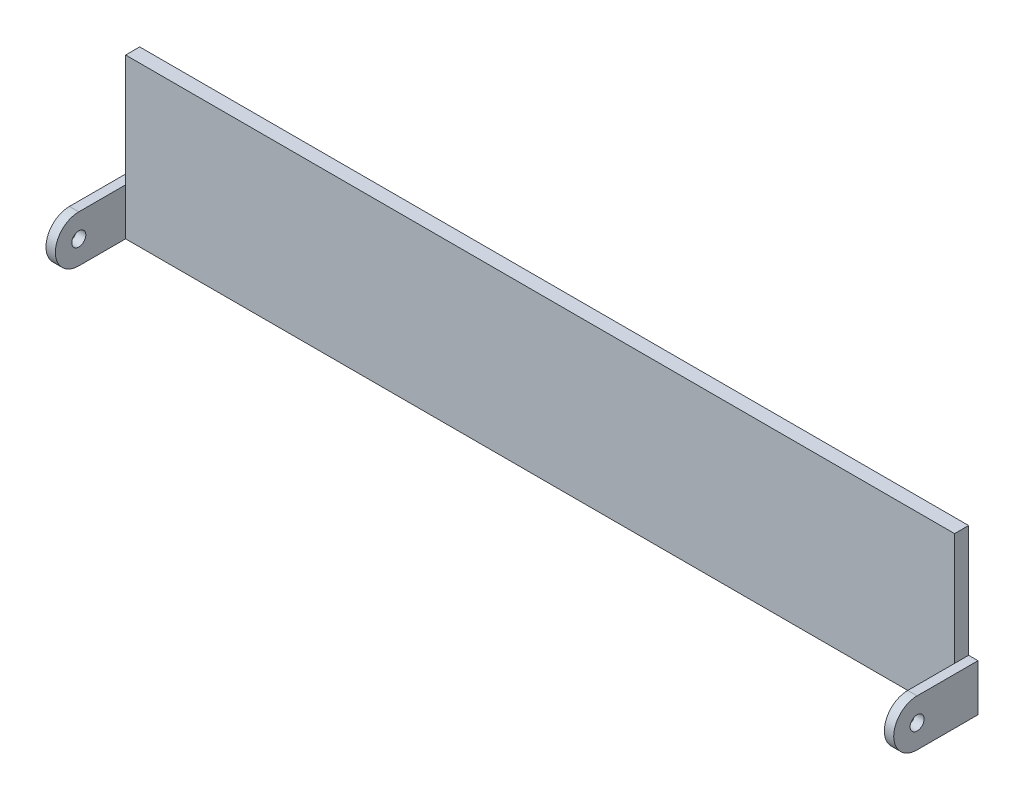
ISO-10303-21;
HEADER;
FILE_DESCRIPTION(('STEP AP214'),'2;1');
FILE_NAME('part.step','',(''),(''),'','','');
FILE_SCHEMA(('AUTOMOTIVE_DESIGN { 1 0 10303 214 1 1 1 1 }'));
ENDSEC;
DATA;
#1=APPLICATION_CONTEXT('core data for automotive mechanical design processes');
#2=APPLICATION_PROTOCOL_DEFINITION('international standard','automotive_design',2000,#1);
#3=PRODUCT_CONTEXT('',#1,'mechanical');
#4=PRODUCT('Part','Part','',(#3));
#5=PRODUCT_RELATED_PRODUCT_CATEGORY('part','',(#4));
#6=PRODUCT_DEFINITION_FORMATION('','',#4);
#7=PRODUCT_DEFINITION_CONTEXT('part definition',#1,'design');
#8=PRODUCT_DEFINITION('design','',#6,#7);
#9=PRODUCT_DEFINITION_SHAPE('','',#8);
#10=(LENGTH_UNIT() NAMED_UNIT(*) SI_UNIT(.MILLI.,.METRE.));
#11=(NAMED_UNIT(*) PLANE_ANGLE_UNIT() SI_UNIT($,.RADIAN.));
#12=(NAMED_UNIT(*) SI_UNIT($,.STERADIAN.) SOLID_ANGLE_UNIT());
#13=UNCERTAINTY_MEASURE_WITH_UNIT(LENGTH_MEASURE(1.E-05),#10,'distance_accuracy_value','');
#14=(GEOMETRIC_REPRESENTATION_CONTEXT(3) GLOBAL_UNCERTAINTY_ASSIGNED_CONTEXT((#13)) GLOBAL_UNIT_ASSIGNED_CONTEXT((#10,
#11,#12)) REPRESENTATION_CONTEXT('',''));
#15=CARTESIAN_POINT('',(0.,0.,0.));
#16=DIRECTION('',(0.,0.,1.));
#17=DIRECTION('',(1.,0.,0.));
#18=AXIS2_PLACEMENT_3D('',#15,#16,#17);
#19=CARTESIAN_POINT('',(90.5,-21.5,3.));
#20=DIRECTION('',(-1.,0.,0.));
#21=DIRECTION('',(0.,0.,1.));
#22=AXIS2_PLACEMENT_3D('',#19,#20,#21);
#23=PLANE('',#22);
#24=DIRECTION('',(0.,0.,1.));
#25=VECTOR('',#24,1.);
#26=CARTESIAN_POINT('',(90.5,-11.5,0.));
#27=LINE('',#26,#25);
#28=CARTESIAN_POINT('',(90.5,-11.5,0.));
#29=VERTEX_POINT('',#28);
#30=CARTESIAN_POINT('',(90.5,-11.5,3.));
#31=VERTEX_POINT('',#30);
#32=EDGE_CURVE('E90',#29,#31,#27,.T.);
#33=ORIENTED_EDGE('',*,*,#32,.F.);
#34=DIRECTION('',(0.,1.,0.));
#35=VECTOR('',#34,1.);
#36=CARTESIAN_POINT('',(90.5,-21.5,0.));
#37=LINE('',#36,#35);
#38=CARTESIAN_POINT('',(90.5,12.5,0.));
#39=VERTEX_POINT('',#38);
#40=EDGE_CURVE('E235',#29,#39,#37,.T.);
#41=ORIENTED_EDGE('',*,*,#40,.T.);
#42=DIRECTION('',(0.,0.,-1.));
#43=VECTOR('',#42,1.);
#44=CARTESIAN_POINT('',(90.5,12.5,3.));
#45=LINE('',#44,#43);
#46=CARTESIAN_POINT('',(90.5,12.5,3.));
#47=VERTEX_POINT('',#46);
#48=EDGE_CURVE('E12',#47,#39,#45,.T.);
#49=ORIENTED_EDGE('',*,*,#48,.F.);
#50=DIRECTION('',(0.,1.,0.));
#51=VECTOR('',#50,1.);
#52=CARTESIAN_POINT('',(90.5,-21.5,3.));
#53=LINE('',#52,#51);
#54=EDGE_CURVE('E253',#31,#47,#53,.T.);
#55=ORIENTED_EDGE('',*,*,#54,.F.);
#56=EDGE_LOOP('',(#33,#41,#49,#55));
#57=FACE_BOUND('',#56,.T.);
#58=ADVANCED_FACE('F75',(#57),#23,.F.);
#59=CARTESIAN_POINT('',(-86.5,12.5,3.));
#60=DIRECTION('',(0.,-1.,0.));
#61=DIRECTION('',(0.,0.,-1.));
#62=AXIS2_PLACEMENT_3D('',#59,#60,#61);
#63=PLANE('',#62);
#64=DIRECTION('',(-1.,0.,0.));
#65=VECTOR('',#64,1.);
#66=CARTESIAN_POINT('',(-86.5,12.5,0.));
#67=LINE('',#66,#65);
#68=CARTESIAN_POINT('',(-86.5,12.5,0.));
#69=VERTEX_POINT('',#68);
#70=EDGE_CURVE('E266',#39,#69,#67,.T.);
#71=ORIENTED_EDGE('',*,*,#70,.T.);
#72=DIRECTION('',(0.,0.,-1.));
#73=VECTOR('',#72,1.);
#74=CARTESIAN_POINT('',(-86.5,12.5,3.));
#75=LINE('',#74,#73);
#76=CARTESIAN_POINT('',(-86.5,12.5,3.));
#77=VERTEX_POINT('',#76);
#78=EDGE_CURVE('E83',#77,#69,#75,.T.);
#79=ORIENTED_EDGE('',*,*,#78,.F.);
#80=DIRECTION('',(-1.,0.,0.));
#81=VECTOR('',#80,1.);
#82=CARTESIAN_POINT('',(-86.5,12.5,3.));
#83=LINE('',#82,#81);
#84=EDGE_CURVE('E252',#47,#77,#83,.T.);
#85=ORIENTED_EDGE('',*,*,#84,.F.);
#86=ORIENTED_EDGE('',*,*,#48,.T.);
#87=EDGE_LOOP('',(#71,#79,#85,#86));
#88=FACE_BOUND('',#87,.T.);
#89=ADVANCED_FACE('F295',(#88),#63,.F.);
#90=CARTESIAN_POINT('',(-86.5,-21.5,3.));
#91=DIRECTION('',(1.,0.,0.));
#92=DIRECTION('',(0.,0.,-1.));
#93=AXIS2_PLACEMENT_3D('',#90,#91,#92);
#94=PLANE('',#93);
#95=DIRECTION('',(0.,-1.,0.));
#96=VECTOR('',#95,1.);
#97=CARTESIAN_POINT('',(-86.5,-21.5,0.));
#98=LINE('',#97,#96);
#99=CARTESIAN_POINT('',(-86.5,-11.5,0.));
#100=VERTEX_POINT('',#99);
#101=EDGE_CURVE('E269',#69,#100,#98,.T.);
#102=ORIENTED_EDGE('',*,*,#101,.T.);
#103=DIRECTION('',(0.,0.,1.));
#104=VECTOR('',#103,1.);
#105=CARTESIAN_POINT('',(-86.5,-11.5,0.));
#106=LINE('',#105,#104);
#107=CARTESIAN_POINT('',(-86.5,-11.5,3.));
#108=VERTEX_POINT('',#107);
#109=EDGE_CURVE('E226',#100,#108,#106,.T.);
#110=ORIENTED_EDGE('',*,*,#109,.T.);
#111=DIRECTION('',(0.,-1.,0.));
#112=VECTOR('',#111,1.);
#113=CARTESIAN_POINT('',(-86.5,-21.5,3.));
#114=LINE('',#113,#112);
#115=EDGE_CURVE('E257',#77,#108,#114,.T.);
#116=ORIENTED_EDGE('',*,*,#115,.F.);
#117=ORIENTED_EDGE('',*,*,#78,.T.);
#118=EDGE_LOOP('',(#102,#110,#116,#117));
#119=FACE_BOUND('',#118,.T.);
#120=ADVANCED_FACE('F281',(#119),#94,.F.);
#121=CARTESIAN_POINT('',(-86.5,-21.5,3.));
#122=DIRECTION('',(0.,1.,0.));
#123=DIRECTION('',(0.,0.,1.));
#124=AXIS2_PLACEMENT_3D('',#121,#122,#123);
#125=PLANE('',#124);
#126=DIRECTION('',(1.,0.,0.));
#127=VECTOR('',#126,1.);
#128=CARTESIAN_POINT('',(-86.5,-21.5,0.));
#129=LINE('',#128,#127);
#130=CARTESIAN_POINT('',(-88.5,-21.5,0.));
#131=VERTEX_POINT('',#130);
#132=CARTESIAN_POINT('',(92.5,-21.5,0.));
#133=VERTEX_POINT('',#132);
#134=EDGE_CURVE('E273',#131,#133,#129,.T.);
#135=ORIENTED_EDGE('',*,*,#134,.T.);
#136=DIRECTION('',(0.,0.,1.));
#137=VECTOR('',#136,1.);
#138=CARTESIAN_POINT('',(92.5,-21.5,0.));
#139=LINE('',#138,#137);
#140=CARTESIAN_POINT('',(92.5,-21.5,13.));
#141=VERTEX_POINT('',#140);
#142=EDGE_CURVE('E190',#133,#141,#139,.T.);
#143=ORIENTED_EDGE('',*,*,#142,.T.);
#144=DIRECTION('',(-1.,0.,0.));
#145=VECTOR('',#144,1.);
#146=CARTESIAN_POINT('',(92.5,-21.5,13.));
#147=LINE('',#146,#145);
#148=CARTESIAN_POINT('',(90.5,-21.5,13.));
#149=VERTEX_POINT('',#148);
#150=EDGE_CURVE('E173',#141,#149,#147,.T.);
#151=ORIENTED_EDGE('',*,*,#150,.T.);
#152=DIRECTION('',(0.,0.,1.));
#153=VECTOR('',#152,1.);
#154=CARTESIAN_POINT('',(90.5,-21.5,0.));
#155=LINE('',#154,#153);
#156=CARTESIAN_POINT('',(90.5,-21.5,3.));
#157=VERTEX_POINT('',#156);
#158=EDGE_CURVE('E191',#157,#149,#155,.T.);
#159=ORIENTED_EDGE('',*,*,#158,.F.);
#160=DIRECTION('',(1.,0.,0.));
#161=VECTOR('',#160,1.);
#162=CARTESIAN_POINT('',(-86.5,-21.5,3.));
#163=LINE('',#162,#161);
#164=CARTESIAN_POINT('',(-86.5,-21.5,3.));
#165=VERTEX_POINT('',#164);
#166=EDGE_CURVE('E261',#165,#157,#163,.T.);
#167=ORIENTED_EDGE('',*,*,#166,.F.);
#168=DIRECTION('',(0.,0.,1.));
#169=VECTOR('',#168,1.);
#170=CARTESIAN_POINT('',(-86.5,-21.5,0.));
#171=LINE('',#170,#169);
#172=CARTESIAN_POINT('',(-86.5,-21.5,13.));
#173=VERTEX_POINT('',#172);
#174=EDGE_CURVE('E217',#165,#173,#171,.T.);
#175=ORIENTED_EDGE('',*,*,#174,.T.);
#176=DIRECTION('',(1.,0.,0.));
#177=VECTOR('',#176,1.);
#178=CARTESIAN_POINT('',(-88.5,-21.5,13.));
#179=LINE('',#178,#177);
#180=CARTESIAN_POINT('',(-88.5,-21.5,13.));
#181=VERTEX_POINT('',#180);
#182=EDGE_CURVE('E236',#181,#173,#179,.T.);
#183=ORIENTED_EDGE('',*,*,#182,.F.);
#184=DIRECTION('',(0.,0.,1.));
#185=VECTOR('',#184,1.);
#186=CARTESIAN_POINT('',(-88.5,-21.5,0.));
#187=LINE('',#186,#185);
#188=EDGE_CURVE('E216',#131,#181,#187,.T.);
#189=ORIENTED_EDGE('',*,*,#188,.F.);
#190=EDGE_LOOP('',(#135,#143,#151,#159,#167,#175,#183,#189));
#191=FACE_BOUND('',#190,.T.);
#192=ADVANCED_FACE('F298',(#191),#125,.F.);
#193=CARTESIAN_POINT('',(0.,0.,3.));
#194=DIRECTION('',(0.,0.,-1.));
#195=DIRECTION('',(-1.,0.,0.));
#196=AXIS2_PLACEMENT_3D('',#193,#194,#195);
#197=PLANE('',#196);
#198=EDGE_CURVE('E249',#157,#31,#53,.T.);
#199=ORIENTED_EDGE('',*,*,#198,.T.);
#200=ORIENTED_EDGE('',*,*,#54,.T.);
#201=ORIENTED_EDGE('',*,*,#84,.T.);
#202=ORIENTED_EDGE('',*,*,#115,.T.);
#203=EDGE_CURVE('E256',#108,#165,#114,.T.);
#204=ORIENTED_EDGE('',*,*,#203,.T.);
#205=ORIENTED_EDGE('',*,*,#166,.T.);
#206=EDGE_LOOP('',(#199,#200,#201,#202,#204,#205));
#207=FACE_BOUND('',#206,.T.);
#208=ADVANCED_FACE('F292',(#207),#197,.F.);
#209=CARTESIAN_POINT('',(0.,0.,0.));
#210=DIRECTION('',(0.,0.,-1.));
#211=DIRECTION('',(-1.,0.,0.));
#212=AXIS2_PLACEMENT_3D('',#209,#210,#211);
#213=PLANE('',#212);
#214=ORIENTED_EDGE('',*,*,#40,.F.);
#215=DIRECTION('',(-1.,0.,0.));
#216=VECTOR('',#215,1.);
#217=CARTESIAN_POINT('',(92.5,-11.5,0.));
#218=LINE('',#217,#216);
#219=CARTESIAN_POINT('',(92.5,-11.5,0.));
#220=VERTEX_POINT('',#219);
#221=EDGE_CURVE('E203',#220,#29,#218,.T.);
#222=ORIENTED_EDGE('',*,*,#221,.F.);
#223=DIRECTION('',(0.,1.,0.));
#224=VECTOR('',#223,1.);
#225=CARTESIAN_POINT('',(92.5,-21.5,0.));
#226=LINE('',#225,#224);
#227=EDGE_CURVE('E187',#133,#220,#226,.T.);
#228=ORIENTED_EDGE('',*,*,#227,.F.);
#229=ORIENTED_EDGE('',*,*,#134,.F.);
#230=DIRECTION('',(0.,1.,0.));
#231=VECTOR('',#230,1.);
#232=CARTESIAN_POINT('',(-88.5,-21.5,0.));
#233=LINE('',#232,#231);
#234=CARTESIAN_POINT('',(-88.5,-11.5,0.));
#235=VERTEX_POINT('',#234);
#236=EDGE_CURVE('E221',#131,#235,#233,.T.);
#237=ORIENTED_EDGE('',*,*,#236,.T.);
#238=DIRECTION('',(1.,0.,0.));
#239=VECTOR('',#238,1.);
#240=CARTESIAN_POINT('',(-88.5,-11.5,0.));
#241=LINE('',#240,#239);
#242=EDGE_CURVE('E232',#235,#100,#241,.T.);
#243=ORIENTED_EDGE('',*,*,#242,.T.);
#244=ORIENTED_EDGE('',*,*,#101,.F.);
#245=ORIENTED_EDGE('',*,*,#70,.F.);
#246=EDGE_LOOP('',(#214,#222,#228,#229,#237,#243,#244,#245));
#247=FACE_BOUND('',#246,.T.);
#248=ADVANCED_FACE('F286',(#247),#213,.T.);
#249=CARTESIAN_POINT('',(-88.5,-11.5,0.));
#250=DIRECTION('',(0.,1.,0.));
#251=DIRECTION('',(0.,0.,1.));
#252=AXIS2_PLACEMENT_3D('',#249,#250,#251);
#253=PLANE('',#252);
#254=ORIENTED_EDGE('',*,*,#109,.F.);
#255=ORIENTED_EDGE('',*,*,#242,.F.);
#256=DIRECTION('',(0.,0.,1.));
#257=VECTOR('',#256,1.);
#258=CARTESIAN_POINT('',(-88.5,-11.5,0.));
#259=LINE('',#258,#257);
#260=CARTESIAN_POINT('',(-88.5,-11.5,13.));
#261=VERTEX_POINT('',#260);
#262=EDGE_CURVE('E212',#235,#261,#259,.T.);
#263=ORIENTED_EDGE('',*,*,#262,.T.);
#264=DIRECTION('',(1.,0.,0.));
#265=VECTOR('',#264,1.);
#266=CARTESIAN_POINT('',(-88.5,-11.5,13.));
#267=LINE('',#266,#265);
#268=CARTESIAN_POINT('',(-86.5,-11.5,13.));
#269=VERTEX_POINT('',#268);
#270=EDGE_CURVE('E225',#261,#269,#267,.T.);
#271=ORIENTED_EDGE('',*,*,#270,.T.);
#272=EDGE_CURVE('E98',#108,#269,#106,.T.);
#273=ORIENTED_EDGE('',*,*,#272,.F.);
#274=EDGE_LOOP('',(#254,#255,#263,#271,#273));
#275=FACE_BOUND('',#274,.T.);
#276=ADVANCED_FACE('F289',(#275),#253,.T.);
#277=CARTESIAN_POINT('',(-86.5,0.,0.));
#278=DIRECTION('',(-1.,0.,0.));
#279=DIRECTION('',(0.,0.,1.));
#280=AXIS2_PLACEMENT_3D('',#277,#278,#279);
#281=PLANE('',#280);
#282=CARTESIAN_POINT('',(-86.5,-16.5,13.));
#283=DIRECTION('',(-1.,0.,0.));
#284=DIRECTION('',(0.,0.,1.));
#285=AXIS2_PLACEMENT_3D('',#282,#283,#284);
#286=CIRCLE('',#285,1.5);
#287=CARTESIAN_POINT('',(-86.5,-16.5,14.5));
#288=VERTEX_POINT('',#287);
#289=EDGE_CURVE('E198',#288,#288,#286,.T.);
#290=ORIENTED_EDGE('',*,*,#289,.T.);
#291=EDGE_LOOP('',(#290));
#292=FACE_BOUND('',#291,.T.);
#293=ORIENTED_EDGE('',*,*,#203,.F.);
#294=ORIENTED_EDGE('',*,*,#272,.T.);
#295=CARTESIAN_POINT('',(-86.5,-16.5,13.));
#296=DIRECTION('',(-1.,0.,0.));
#297=DIRECTION('',(0.,0.,1.));
#298=AXIS2_PLACEMENT_3D('',#295,#296,#297);
#299=CIRCLE('',#298,5.);
#300=EDGE_CURVE('E172',#173,#269,#299,.T.);
#301=ORIENTED_EDGE('',*,*,#300,.F.);
#302=ORIENTED_EDGE('',*,*,#174,.F.);
#303=EDGE_LOOP('',(#293,#294,#301,#302));
#304=FACE_BOUND('',#303,.T.);
#305=ADVANCED_FACE('F307',(#292,#304),#281,.F.);
#306=CARTESIAN_POINT('',(-88.5,0.,0.));
#307=DIRECTION('',(-1.,0.,0.));
#308=DIRECTION('',(0.,0.,1.));
#309=AXIS2_PLACEMENT_3D('',#306,#307,#308);
#310=PLANE('',#309);
#311=CARTESIAN_POINT('',(-88.5,-16.5,13.));
#312=DIRECTION('',(-1.,0.,0.));
#313=DIRECTION('',(0.,0.,1.));
#314=AXIS2_PLACEMENT_3D('',#311,#312,#313);
#315=CIRCLE('',#314,1.5);
#316=CARTESIAN_POINT('',(-88.5,-16.5,14.5));
#317=VERTEX_POINT('',#316);
#318=EDGE_CURVE('E318',#317,#317,#315,.T.);
#319=ORIENTED_EDGE('',*,*,#318,.F.);
#320=EDGE_LOOP('',(#319));
#321=FACE_BOUND('',#320,.T.);
#322=ORIENTED_EDGE('',*,*,#188,.T.);
#323=CARTESIAN_POINT('',(-88.5,-16.5,13.));
#324=DIRECTION('',(-1.,0.,0.));
#325=DIRECTION('',(0.,0.,1.));
#326=AXIS2_PLACEMENT_3D('',#323,#324,#325);
#327=CIRCLE('',#326,5.);
#328=EDGE_CURVE('E242',#181,#261,#327,.T.);
#329=ORIENTED_EDGE('',*,*,#328,.T.);
#330=ORIENTED_EDGE('',*,*,#262,.F.);
#331=ORIENTED_EDGE('',*,*,#236,.F.);
#332=EDGE_LOOP('',(#322,#329,#330,#331));
#333=FACE_BOUND('',#332,.T.);
#334=ADVANCED_FACE('F302',(#321,#333),#310,.T.);
#335=CARTESIAN_POINT('',(-88.5,-16.5,13.));
#336=DIRECTION('',(1.,0.,0.));
#337=DIRECTION('',(0.,0.,-1.));
#338=AXIS2_PLACEMENT_3D('',#335,#336,#337);
#339=CYLINDRICAL_SURFACE('',#338,5.);
#340=ORIENTED_EDGE('',*,*,#300,.T.);
#341=ORIENTED_EDGE('',*,*,#270,.F.);
#342=ORIENTED_EDGE('',*,*,#328,.F.);
#343=ORIENTED_EDGE('',*,*,#182,.T.);
#344=EDGE_LOOP('',(#340,#341,#342,#343));
#345=FACE_BOUND('',#344,.T.);
#346=ADVANCED_FACE('F305',(#345),#339,.T.);
#347=CARTESIAN_POINT('',(90.5,0.,0.));
#348=DIRECTION('',(-1.,0.,0.));
#349=DIRECTION('',(0.,0.,1.));
#350=AXIS2_PLACEMENT_3D('',#347,#348,#349);
#351=PLANE('',#350);
#352=CARTESIAN_POINT('',(90.5,-16.5,13.));
#353=DIRECTION('',(-1.,0.,0.));
#354=DIRECTION('',(0.,0.,1.));
#355=AXIS2_PLACEMENT_3D('',#352,#353,#354);
#356=CIRCLE('',#355,1.5);
#357=CARTESIAN_POINT('',(90.5,-16.5,14.5));
#358=VERTEX_POINT('',#357);
#359=EDGE_CURVE('E321',#358,#358,#356,.T.);
#360=ORIENTED_EDGE('',*,*,#359,.F.);
#361=EDGE_LOOP('',(#360));
#362=FACE_BOUND('',#361,.T.);
#363=ORIENTED_EDGE('',*,*,#198,.F.);
#364=ORIENTED_EDGE('',*,*,#158,.T.);
#365=CARTESIAN_POINT('',(90.5,-16.5,13.));
#366=DIRECTION('',(1.,0.,0.));
#367=DIRECTION('',(0.,0.,-1.));
#368=AXIS2_PLACEMENT_3D('',#365,#366,#367);
#369=CIRCLE('',#368,4.99999999999998);
#370=CARTESIAN_POINT('',(90.5,-11.5,13.));
#371=VERTEX_POINT('',#370);
#372=EDGE_CURVE('E183',#371,#149,#369,.T.);
#373=ORIENTED_EDGE('',*,*,#372,.F.);
#374=EDGE_CURVE('E167',#31,#371,#27,.T.);
#375=ORIENTED_EDGE('',*,*,#374,.F.);
#376=EDGE_LOOP('',(#363,#364,#373,#375));
#377=FACE_BOUND('',#376,.T.);
#378=ADVANCED_FACE('F313',(#362,#377),#351,.T.);
#379=CARTESIAN_POINT('',(92.5,-11.5,0.));
#380=DIRECTION('',(0.,-1.,0.));
#381=DIRECTION('',(0.,0.,-1.));
#382=AXIS2_PLACEMENT_3D('',#379,#380,#381);
#383=PLANE('',#382);
#384=ORIENTED_EDGE('',*,*,#32,.T.);
#385=ORIENTED_EDGE('',*,*,#374,.T.);
#386=DIRECTION('',(-1.,0.,0.));
#387=VECTOR('',#386,1.);
#388=CARTESIAN_POINT('',(92.5,-11.5,13.));
#389=LINE('',#388,#387);
#390=CARTESIAN_POINT('',(92.5,-11.5,13.));
#391=VERTEX_POINT('',#390);
#392=EDGE_CURVE('E160',#391,#371,#389,.T.);
#393=ORIENTED_EDGE('',*,*,#392,.F.);
#394=DIRECTION('',(0.,0.,1.));
#395=VECTOR('',#394,1.);
#396=CARTESIAN_POINT('',(92.5,-11.5,0.));
#397=LINE('',#396,#395);
#398=EDGE_CURVE('E165',#220,#391,#397,.T.);
#399=ORIENTED_EDGE('',*,*,#398,.F.);
#400=ORIENTED_EDGE('',*,*,#221,.T.);
#401=EDGE_LOOP('',(#384,#385,#393,#399,#400));
#402=FACE_BOUND('',#401,.T.);
#403=ADVANCED_FACE('F162',(#402),#383,.F.);
#404=CARTESIAN_POINT('',(92.5,0.,0.));
#405=DIRECTION('',(-1.,0.,0.));
#406=DIRECTION('',(0.,0.,1.));
#407=AXIS2_PLACEMENT_3D('',#404,#405,#406);
#408=PLANE('',#407);
#409=CARTESIAN_POINT('',(92.5,-16.5,13.));
#410=DIRECTION('',(1.,0.,0.));
#411=DIRECTION('',(0.,0.,-1.));
#412=AXIS2_PLACEMENT_3D('',#409,#410,#411);
#413=CIRCLE('',#412,1.5);
#414=CARTESIAN_POINT('',(92.5,-16.5,11.5));
#415=VERTEX_POINT('',#414);
#416=EDGE_CURVE('E324',#415,#415,#413,.T.);
#417=ORIENTED_EDGE('',*,*,#416,.F.);
#418=EDGE_LOOP('',(#417));
#419=FACE_BOUND('',#418,.T.);
#420=ORIENTED_EDGE('',*,*,#398,.T.);
#421=CARTESIAN_POINT('',(92.5,-16.5,13.));
#422=DIRECTION('',(1.,0.,0.));
#423=DIRECTION('',(0.,0.,-1.));
#424=AXIS2_PLACEMENT_3D('',#421,#422,#423);
#425=CIRCLE('',#424,4.99999999999998);
#426=EDGE_CURVE('E176',#391,#141,#425,.T.);
#427=ORIENTED_EDGE('',*,*,#426,.T.);
#428=ORIENTED_EDGE('',*,*,#142,.F.);
#429=ORIENTED_EDGE('',*,*,#227,.T.);
#430=EDGE_LOOP('',(#420,#427,#428,#429));
#431=FACE_BOUND('',#430,.T.);
#432=ADVANCED_FACE('F185',(#419,#431),#408,.F.);
#433=CARTESIAN_POINT('',(92.5,-16.5,13.));
#434=DIRECTION('',(-1.,0.,0.));
#435=DIRECTION('',(0.,0.,1.));
#436=AXIS2_PLACEMENT_3D('',#433,#434,#435);
#437=CYLINDRICAL_SURFACE('',#436,4.99999999999998);
#438=ORIENTED_EDGE('',*,*,#392,.T.);
#439=ORIENTED_EDGE('',*,*,#372,.T.);
#440=ORIENTED_EDGE('',*,*,#150,.F.);
#441=ORIENTED_EDGE('',*,*,#426,.F.);
#442=EDGE_LOOP('',(#438,#439,#440,#441));
#443=FACE_BOUND('',#442,.T.);
#444=ADVANCED_FACE('F177',(#443),#437,.T.);
#445=CARTESIAN_POINT('',(-107.5,-16.5,13.));
#446=DIRECTION('',(1.,0.,0.));
#447=DIRECTION('',(0.,0.,-1.));
#448=AXIS2_PLACEMENT_3D('',#445,#446,#447);
#449=CYLINDRICAL_SURFACE('',#448,1.5);
#450=ORIENTED_EDGE('',*,*,#359,.T.);
#451=EDGE_LOOP('',(#450));
#452=FACE_BOUND('',#451,.T.);
#453=ORIENTED_EDGE('',*,*,#416,.T.);
#454=EDGE_LOOP('',(#453));
#455=FACE_BOUND('',#454,.T.);
#456=ADVANCED_FACE('F330',(#452,#455),#449,.F.);
#457=ORIENTED_EDGE('',*,*,#318,.T.);
#458=EDGE_LOOP('',(#457));
#459=FACE_BOUND('',#458,.T.);
#460=ORIENTED_EDGE('',*,*,#289,.F.);
#461=EDGE_LOOP('',(#460));
#462=FACE_BOUND('',#461,.T.);
#463=ADVANCED_FACE('F373',(#459,#462),#449,.F.);
#464=CLOSED_SHELL('',(#58,#89,#120,#192,#208,#248,#276,#305,#334,#346,#378,#403,#432,#444,#456,#463));
#465=MANIFOLD_SOLID_BREP('B2',#464);
#466=ADVANCED_BREP_SHAPE_REPRESENTATION('',(#18,#465),#14);
#467=SHAPE_DEFINITION_REPRESENTATION(#9,#466);
ENDSEC;
END-ISO-10303-21;
